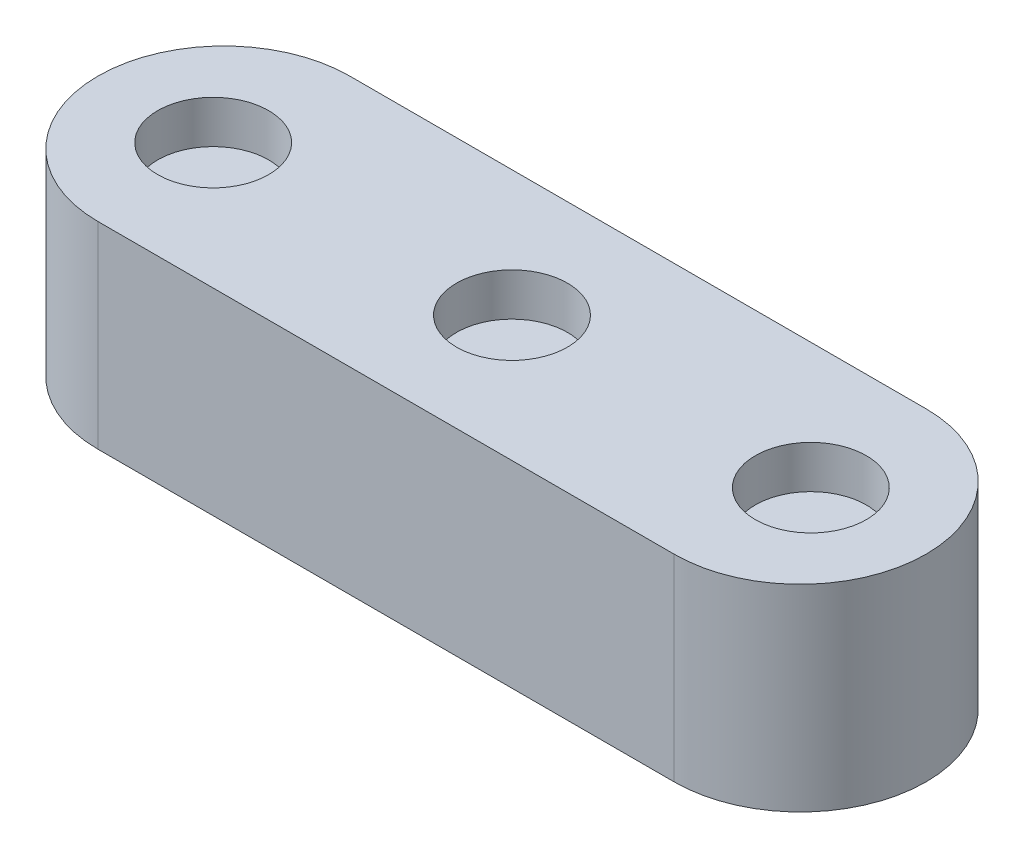
ISO-10303-21;
HEADER;
FILE_DESCRIPTION(('STEP AP214'),'2;1');
FILE_NAME('part.step','',(''),(''),'','','');
FILE_SCHEMA(('AUTOMOTIVE_DESIGN { 1 0 10303 214 1 1 1 1 }'));
ENDSEC;
DATA;
#1=APPLICATION_CONTEXT('core data for automotive mechanical design processes');
#2=APPLICATION_PROTOCOL_DEFINITION('international standard','automotive_design',2000,#1);
#3=PRODUCT_CONTEXT('',#1,'mechanical');
#4=PRODUCT('Part','Part','',(#3));
#5=PRODUCT_RELATED_PRODUCT_CATEGORY('part','',(#4));
#6=PRODUCT_DEFINITION_FORMATION('','',#4);
#7=PRODUCT_DEFINITION_CONTEXT('part definition',#1,'design');
#8=PRODUCT_DEFINITION('design','',#6,#7);
#9=PRODUCT_DEFINITION_SHAPE('','',#8);
#10=(LENGTH_UNIT() NAMED_UNIT(*) SI_UNIT(.MILLI.,.METRE.));
#11=(NAMED_UNIT(*) PLANE_ANGLE_UNIT() SI_UNIT($,.RADIAN.));
#12=(NAMED_UNIT(*) SI_UNIT($,.STERADIAN.) SOLID_ANGLE_UNIT());
#13=UNCERTAINTY_MEASURE_WITH_UNIT(LENGTH_MEASURE(1.E-05),#10,'distance_accuracy_value','');
#14=(GEOMETRIC_REPRESENTATION_CONTEXT(3) GLOBAL_UNCERTAINTY_ASSIGNED_CONTEXT((#13)) GLOBAL_UNIT_ASSIGNED_CONTEXT((#10,
#11,#12)) REPRESENTATION_CONTEXT('',''));
#15=CARTESIAN_POINT('',(0.,0.,0.));
#16=DIRECTION('',(0.,0.,1.));
#17=DIRECTION('',(1.,0.,0.));
#18=AXIS2_PLACEMENT_3D('',#15,#16,#17);
#19=CARTESIAN_POINT('',(33.75,23.1,0.));
#20=DIRECTION('',(0.,-1.,0.));
#21=DIRECTION('',(0.,0.,-1.));
#22=AXIS2_PLACEMENT_3D('',#19,#20,#21);
#23=CYLINDRICAL_SURFACE('',#22,14.75);
#24=CARTESIAN_POINT('',(33.75,0.,0.));
#25=DIRECTION('',(0.,1.,0.));
#26=DIRECTION('',(0.,0.,1.));
#27=AXIS2_PLACEMENT_3D('',#24,#25,#26);
#28=CIRCLE('',#27,14.75);
#29=CARTESIAN_POINT('',(33.75,0.,-14.75));
#30=VERTEX_POINT('',#29);
#31=CARTESIAN_POINT('',(33.75,0.,14.75));
#32=VERTEX_POINT('',#31);
#33=EDGE_CURVE('E119',#30,#32,#28,.F.);
#34=ORIENTED_EDGE('',*,*,#33,.F.);
#35=DIRECTION('',(0.,-1.,0.));
#36=VECTOR('',#35,1.);
#37=CARTESIAN_POINT('',(33.75,23.1,-14.75));
#38=LINE('',#37,#36);
#39=CARTESIAN_POINT('',(33.75,23.1,-14.75));
#40=VERTEX_POINT('',#39);
#41=EDGE_CURVE('E11',#40,#30,#38,.T.);
#42=ORIENTED_EDGE('',*,*,#41,.F.);
#43=CARTESIAN_POINT('',(33.75,23.1,0.));
#44=DIRECTION('',(0.,1.,0.));
#45=DIRECTION('',(0.,0.,1.));
#46=AXIS2_PLACEMENT_3D('',#43,#44,#45);
#47=CIRCLE('',#46,14.75);
#48=CARTESIAN_POINT('',(33.75,23.1,14.75));
#49=VERTEX_POINT('',#48);
#50=EDGE_CURVE('E109',#40,#49,#47,.F.);
#51=ORIENTED_EDGE('',*,*,#50,.T.);
#52=DIRECTION('',(0.,-1.,0.));
#53=VECTOR('',#52,1.);
#54=CARTESIAN_POINT('',(33.75,23.1,14.75));
#55=LINE('',#54,#53);
#56=EDGE_CURVE('E89',#49,#32,#55,.T.);
#57=ORIENTED_EDGE('',*,*,#56,.T.);
#58=EDGE_LOOP('',(#34,#42,#51,#57));
#59=FACE_BOUND('',#58,.T.);
#60=ADVANCED_FACE('F51',(#59),#23,.T.);
#61=CARTESIAN_POINT('',(0.,23.1,-14.75));
#62=DIRECTION('',(0.,0.,-1.));
#63=DIRECTION('',(-1.,0.,0.));
#64=AXIS2_PLACEMENT_3D('',#61,#62,#63);
#65=PLANE('',#64);
#66=DIRECTION('',(1.,0.,0.));
#67=VECTOR('',#66,1.);
#68=CARTESIAN_POINT('',(0.,0.,-14.75));
#69=LINE('',#68,#67);
#70=CARTESIAN_POINT('',(-33.75,0.,-14.7499999999999));
#71=VERTEX_POINT('',#70);
#72=EDGE_CURVE('E102',#71,#30,#69,.T.);
#73=ORIENTED_EDGE('',*,*,#72,.F.);
#74=DIRECTION('',(0.,-1.,0.));
#75=VECTOR('',#74,1.);
#76=CARTESIAN_POINT('',(-33.75,23.1,-14.7499999999999));
#77=LINE('',#76,#75);
#78=CARTESIAN_POINT('',(-33.75,23.1,-14.7499999999999));
#79=VERTEX_POINT('',#78);
#80=EDGE_CURVE('E58',#79,#71,#77,.T.);
#81=ORIENTED_EDGE('',*,*,#80,.F.);
#82=DIRECTION('',(1.,0.,0.));
#83=VECTOR('',#82,1.);
#84=CARTESIAN_POINT('',(0.,23.1,-14.75));
#85=LINE('',#84,#83);
#86=EDGE_CURVE('E98',#79,#40,#85,.T.);
#87=ORIENTED_EDGE('',*,*,#86,.T.);
#88=ORIENTED_EDGE('',*,*,#41,.T.);
#89=EDGE_LOOP('',(#73,#81,#87,#88));
#90=FACE_BOUND('',#89,.T.);
#91=ADVANCED_FACE('F97',(#90),#65,.T.);
#92=CARTESIAN_POINT('',(-33.75,23.1,0.));
#93=DIRECTION('',(0.,-1.,0.));
#94=DIRECTION('',(0.,0.,-1.));
#95=AXIS2_PLACEMENT_3D('',#92,#93,#94);
#96=CYLINDRICAL_SURFACE('',#95,14.75);
#97=CARTESIAN_POINT('',(-33.75,0.,0.));
#98=DIRECTION('',(0.,1.,0.));
#99=DIRECTION('',(0.,0.,1.));
#100=AXIS2_PLACEMENT_3D('',#97,#98,#99);
#101=CIRCLE('',#100,14.75);
#102=CARTESIAN_POINT('',(-33.75,0.,14.7500000000001));
#103=VERTEX_POINT('',#102);
#104=EDGE_CURVE('E128',#103,#71,#101,.F.);
#105=ORIENTED_EDGE('',*,*,#104,.F.);
#106=DIRECTION('',(0.,-1.,0.));
#107=VECTOR('',#106,1.);
#108=CARTESIAN_POINT('',(-33.75,23.1,14.7500000000001));
#109=LINE('',#108,#107);
#110=CARTESIAN_POINT('',(-33.75,23.1,14.7500000000001));
#111=VERTEX_POINT('',#110);
#112=EDGE_CURVE('E81',#111,#103,#109,.T.);
#113=ORIENTED_EDGE('',*,*,#112,.F.);
#114=CARTESIAN_POINT('',(-33.75,23.1,0.));
#115=DIRECTION('',(0.,1.,0.));
#116=DIRECTION('',(0.,0.,1.));
#117=AXIS2_PLACEMENT_3D('',#114,#115,#116);
#118=CIRCLE('',#117,14.75);
#119=EDGE_CURVE('E108',#111,#79,#118,.F.);
#120=ORIENTED_EDGE('',*,*,#119,.T.);
#121=ORIENTED_EDGE('',*,*,#80,.T.);
#122=EDGE_LOOP('',(#105,#113,#120,#121));
#123=FACE_BOUND('',#122,.T.);
#124=ADVANCED_FACE('F115',(#123),#96,.T.);
#125=CARTESIAN_POINT('',(0.,23.1,14.75));
#126=DIRECTION('',(0.,0.,-1.));
#127=DIRECTION('',(-1.,0.,0.));
#128=AXIS2_PLACEMENT_3D('',#125,#126,#127);
#129=PLANE('',#128);
#130=DIRECTION('',(1.,0.,0.));
#131=VECTOR('',#130,1.);
#132=CARTESIAN_POINT('',(0.,0.,14.75));
#133=LINE('',#132,#131);
#134=EDGE_CURVE('E129',#103,#32,#133,.T.);
#135=ORIENTED_EDGE('',*,*,#134,.T.);
#136=ORIENTED_EDGE('',*,*,#56,.F.);
#137=DIRECTION('',(1.,0.,0.));
#138=VECTOR('',#137,1.);
#139=CARTESIAN_POINT('',(0.,23.1,14.75));
#140=LINE('',#139,#138);
#141=EDGE_CURVE('E66',#111,#49,#140,.T.);
#142=ORIENTED_EDGE('',*,*,#141,.F.);
#143=ORIENTED_EDGE('',*,*,#112,.T.);
#144=EDGE_LOOP('',(#135,#136,#142,#143));
#145=FACE_BOUND('',#144,.T.);
#146=ADVANCED_FACE('F168',(#145),#129,.F.);
#147=CARTESIAN_POINT('',(0.,23.1,0.));
#148=DIRECTION('',(0.,1.,0.));
#149=DIRECTION('',(0.,0.,1.));
#150=AXIS2_PLACEMENT_3D('',#147,#148,#149);
#151=PLANE('',#150);
#152=CARTESIAN_POINT('',(35.,23.1,0.));
#153=DIRECTION('',(0.,1.,0.));
#154=DIRECTION('',(0.,0.,1.));
#155=AXIS2_PLACEMENT_3D('',#152,#153,#154);
#156=CIRCLE('',#155,6.5);
#157=CARTESIAN_POINT('',(35.,23.1,6.5));
#158=VERTEX_POINT('',#157);
#159=EDGE_CURVE('E146',#158,#158,#156,.T.);
#160=ORIENTED_EDGE('',*,*,#159,.F.);
#161=EDGE_LOOP('',(#160));
#162=FACE_BOUND('',#161,.T.);
#163=CARTESIAN_POINT('',(-35.,23.1,0.));
#164=DIRECTION('',(0.,1.,0.));
#165=DIRECTION('',(0.,0.,1.));
#166=AXIS2_PLACEMENT_3D('',#163,#164,#165);
#167=CIRCLE('',#166,6.5);
#168=CARTESIAN_POINT('',(-35.,23.1,6.5));
#169=VERTEX_POINT('',#168);
#170=EDGE_CURVE('E141',#169,#169,#167,.T.);
#171=ORIENTED_EDGE('',*,*,#170,.F.);
#172=EDGE_LOOP('',(#171));
#173=FACE_BOUND('',#172,.T.);
#174=CARTESIAN_POINT('',(0.,23.1,0.));
#175=DIRECTION('',(0.,1.,0.));
#176=DIRECTION('',(0.,0.,1.));
#177=AXIS2_PLACEMENT_3D('',#174,#175,#176);
#178=CIRCLE('',#177,6.5);
#179=CARTESIAN_POINT('',(0.,23.1,6.5));
#180=VERTEX_POINT('',#179);
#181=EDGE_CURVE('E140',#180,#180,#178,.T.);
#182=ORIENTED_EDGE('',*,*,#181,.F.);
#183=EDGE_LOOP('',(#182));
#184=FACE_BOUND('',#183,.T.);
#185=ORIENTED_EDGE('',*,*,#50,.F.);
#186=ORIENTED_EDGE('',*,*,#86,.F.);
#187=ORIENTED_EDGE('',*,*,#119,.F.);
#188=ORIENTED_EDGE('',*,*,#141,.T.);
#189=EDGE_LOOP('',(#185,#186,#187,#188));
#190=FACE_BOUND('',#189,.T.);
#191=ADVANCED_FACE('F110',(#162,#173,#184,#190),#151,.T.);
#192=CARTESIAN_POINT('',(0.,0.,0.));
#193=DIRECTION('',(0.,1.,0.));
#194=DIRECTION('',(0.,0.,1.));
#195=AXIS2_PLACEMENT_3D('',#192,#193,#194);
#196=PLANE('',#195);
#197=ORIENTED_EDGE('',*,*,#33,.T.);
#198=ORIENTED_EDGE('',*,*,#134,.F.);
#199=ORIENTED_EDGE('',*,*,#104,.T.);
#200=ORIENTED_EDGE('',*,*,#72,.T.);
#201=EDGE_LOOP('',(#197,#198,#199,#200));
#202=FACE_BOUND('',#201,.T.);
#203=ADVANCED_FACE('F161',(#202),#196,.F.);
#204=CARTESIAN_POINT('',(0.,18.1,0.));
#205=DIRECTION('',(0.,1.,0.));
#206=DIRECTION('',(0.,0.,1.));
#207=AXIS2_PLACEMENT_3D('',#204,#205,#206);
#208=CYLINDRICAL_SURFACE('',#207,6.5);
#209=CARTESIAN_POINT('',(0.,18.1,0.));
#210=DIRECTION('',(0.,1.,0.));
#211=DIRECTION('',(0.,0.,1.));
#212=AXIS2_PLACEMENT_3D('',#209,#210,#211);
#213=CIRCLE('',#212,6.5);
#214=CARTESIAN_POINT('',(0.,18.1,6.5));
#215=VERTEX_POINT('',#214);
#216=EDGE_CURVE('E121',#215,#215,#213,.T.);
#217=ORIENTED_EDGE('',*,*,#216,.F.);
#218=EDGE_LOOP('',(#217));
#219=FACE_BOUND('',#218,.T.);
#220=ORIENTED_EDGE('',*,*,#181,.T.);
#221=EDGE_LOOP('',(#220));
#222=FACE_BOUND('',#221,.T.);
#223=ADVANCED_FACE('F173',(#219,#222),#208,.F.);
#224=CARTESIAN_POINT('',(0.,18.1,0.));
#225=DIRECTION('',(0.,1.,0.));
#226=DIRECTION('',(0.,0.,1.));
#227=AXIS2_PLACEMENT_3D('',#224,#225,#226);
#228=PLANE('',#227);
#229=ORIENTED_EDGE('',*,*,#216,.T.);
#230=EDGE_LOOP('',(#229));
#231=FACE_BOUND('',#230,.T.);
#232=ADVANCED_FACE('F171',(#231),#228,.T.);
#233=CARTESIAN_POINT('',(-35.,18.1,0.));
#234=DIRECTION('',(0.,1.,0.));
#235=DIRECTION('',(0.,0.,1.));
#236=AXIS2_PLACEMENT_3D('',#233,#234,#235);
#237=CYLINDRICAL_SURFACE('',#236,6.5);
#238=CARTESIAN_POINT('',(-35.,18.1,0.));
#239=DIRECTION('',(0.,1.,0.));
#240=DIRECTION('',(0.,0.,1.));
#241=AXIS2_PLACEMENT_3D('',#238,#239,#240);
#242=CIRCLE('',#241,6.5);
#243=CARTESIAN_POINT('',(-35.,18.1,6.5));
#244=VERTEX_POINT('',#243);
#245=EDGE_CURVE('E153',#244,#244,#242,.T.);
#246=ORIENTED_EDGE('',*,*,#245,.F.);
#247=EDGE_LOOP('',(#246));
#248=FACE_BOUND('',#247,.T.);
#249=ORIENTED_EDGE('',*,*,#170,.T.);
#250=EDGE_LOOP('',(#249));
#251=FACE_BOUND('',#250,.T.);
#252=ADVANCED_FACE('F162',(#248,#251),#237,.F.);
#253=CARTESIAN_POINT('',(-35.,18.1,0.));
#254=DIRECTION('',(0.,1.,0.));
#255=DIRECTION('',(0.,0.,1.));
#256=AXIS2_PLACEMENT_3D('',#253,#254,#255);
#257=PLANE('',#256);
#258=ORIENTED_EDGE('',*,*,#245,.T.);
#259=EDGE_LOOP('',(#258));
#260=FACE_BOUND('',#259,.T.);
#261=ADVANCED_FACE('F262',(#260),#257,.T.);
#262=CARTESIAN_POINT('',(35.,18.1,0.));
#263=DIRECTION('',(0.,1.,0.));
#264=DIRECTION('',(0.,0.,1.));
#265=AXIS2_PLACEMENT_3D('',#262,#263,#264);
#266=CYLINDRICAL_SURFACE('',#265,6.5);
#267=CARTESIAN_POINT('',(35.,18.1,0.));
#268=DIRECTION('',(0.,1.,0.));
#269=DIRECTION('',(0.,0.,1.));
#270=AXIS2_PLACEMENT_3D('',#267,#268,#269);
#271=CIRCLE('',#270,6.5);
#272=CARTESIAN_POINT('',(35.,18.1,6.5));
#273=VERTEX_POINT('',#272);
#274=EDGE_CURVE('E144',#273,#273,#271,.T.);
#275=ORIENTED_EDGE('',*,*,#274,.F.);
#276=EDGE_LOOP('',(#275));
#277=FACE_BOUND('',#276,.T.);
#278=ORIENTED_EDGE('',*,*,#159,.T.);
#279=EDGE_LOOP('',(#278));
#280=FACE_BOUND('',#279,.T.);
#281=ADVANCED_FACE('F272',(#277,#280),#266,.F.);
#282=CARTESIAN_POINT('',(35.,18.1,0.));
#283=DIRECTION('',(0.,1.,0.));
#284=DIRECTION('',(0.,0.,1.));
#285=AXIS2_PLACEMENT_3D('',#282,#283,#284);
#286=PLANE('',#285);
#287=ORIENTED_EDGE('',*,*,#274,.T.);
#288=EDGE_LOOP('',(#287));
#289=FACE_BOUND('',#288,.T.);
#290=ADVANCED_FACE('F284',(#289),#286,.T.);
#291=CLOSED_SHELL('',(#60,#91,#124,#146,#191,#203,#223,#232,#252,#261,#281,#290));
#292=MANIFOLD_SOLID_BREP('B2',#291);
#293=ADVANCED_BREP_SHAPE_REPRESENTATION('',(#18,#292),#14);
#294=SHAPE_DEFINITION_REPRESENTATION(#9,#293);
ENDSEC;
END-ISO-10303-21;
